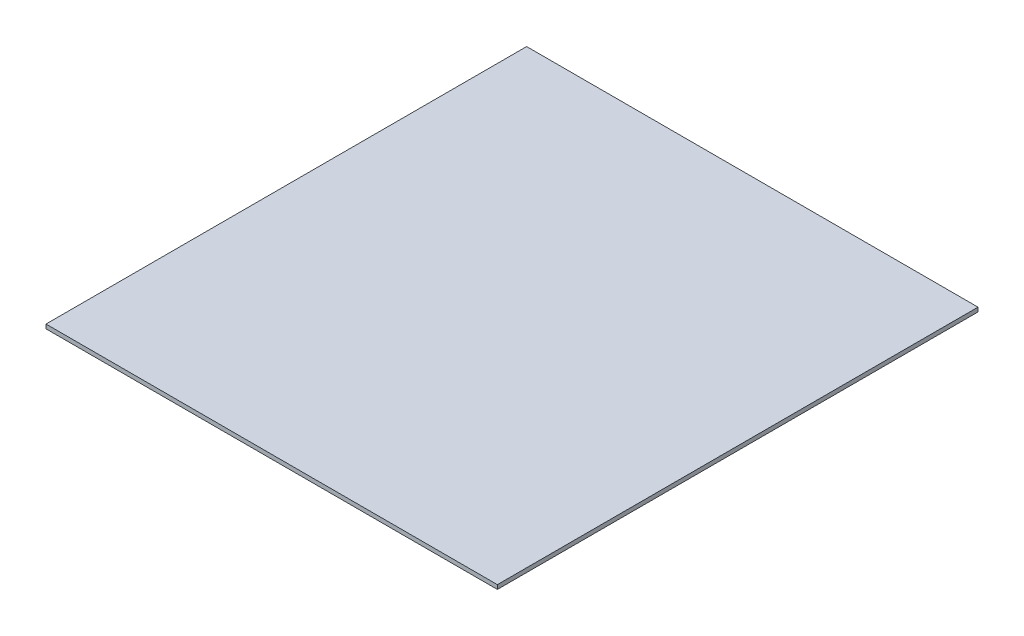
ISO-10303-21;
HEADER;
FILE_DESCRIPTION(('STEP AP214'),'2;1');
FILE_NAME('part.step','',(''),(''),'','','');
FILE_SCHEMA(('AUTOMOTIVE_DESIGN { 1 0 10303 214 1 1 1 1 }'));
ENDSEC;
DATA;
#1=APPLICATION_CONTEXT('core data for automotive mechanical design processes');
#2=APPLICATION_PROTOCOL_DEFINITION('international standard','automotive_design',2000,#1);
#3=PRODUCT_CONTEXT('',#1,'mechanical');
#4=PRODUCT('Part','Part','',(#3));
#5=PRODUCT_RELATED_PRODUCT_CATEGORY('part','',(#4));
#6=PRODUCT_DEFINITION_FORMATION('','',#4);
#7=PRODUCT_DEFINITION_CONTEXT('part definition',#1,'design');
#8=PRODUCT_DEFINITION('design','',#6,#7);
#9=PRODUCT_DEFINITION_SHAPE('','',#8);
#10=(LENGTH_UNIT() NAMED_UNIT(*) SI_UNIT(.MILLI.,.METRE.));
#11=(NAMED_UNIT(*) PLANE_ANGLE_UNIT() SI_UNIT($,.RADIAN.));
#12=(NAMED_UNIT(*) SI_UNIT($,.STERADIAN.) SOLID_ANGLE_UNIT());
#13=UNCERTAINTY_MEASURE_WITH_UNIT(LENGTH_MEASURE(1.E-05),#10,'distance_accuracy_value','');
#14=(GEOMETRIC_REPRESENTATION_CONTEXT(3) GLOBAL_UNCERTAINTY_ASSIGNED_CONTEXT((#13)) GLOBAL_UNIT_ASSIGNED_CONTEXT((#10,
#11,#12)) REPRESENTATION_CONTEXT('',''));
#15=CARTESIAN_POINT('',(0.,0.,0.));
#16=DIRECTION('',(0.,0.,1.));
#17=DIRECTION('',(1.,0.,0.));
#18=AXIS2_PLACEMENT_3D('',#15,#16,#17);
#19=CARTESIAN_POINT('',(0.,5.,0.));
#20=DIRECTION('',(-1.,0.,0.));
#21=DIRECTION('',(0.,0.,1.));
#22=AXIS2_PLACEMENT_3D('',#19,#20,#21);
#23=PLANE('',#22);
#24=DIRECTION('',(0.,0.,-1.));
#25=VECTOR('',#24,1.);
#26=CARTESIAN_POINT('',(0.,0.,0.));
#27=LINE('',#26,#25);
#28=CARTESIAN_POINT('',(0.,0.,575.));
#29=VERTEX_POINT('',#28);
#30=CARTESIAN_POINT('',(0.,0.,0.));
#31=VERTEX_POINT('',#30);
#32=EDGE_CURVE('E96',#29,#31,#27,.T.);
#33=ORIENTED_EDGE('',*,*,#32,.T.);
#34=DIRECTION('',(0.,-1.,0.));
#35=VECTOR('',#34,1.);
#36=CARTESIAN_POINT('',(0.,5.,0.));
#37=LINE('',#36,#35);
#38=CARTESIAN_POINT('',(0.,5.,0.));
#39=VERTEX_POINT('',#38);
#40=EDGE_CURVE('E11',#39,#31,#37,.T.);
#41=ORIENTED_EDGE('',*,*,#40,.F.);
#42=DIRECTION('',(0.,0.,-1.));
#43=VECTOR('',#42,1.);
#44=CARTESIAN_POINT('',(0.,5.,0.));
#45=LINE('',#44,#43);
#46=CARTESIAN_POINT('',(0.,5.,575.));
#47=VERTEX_POINT('',#46);
#48=EDGE_CURVE('E84',#47,#39,#45,.T.);
#49=ORIENTED_EDGE('',*,*,#48,.F.);
#50=DIRECTION('',(0.,-1.,0.));
#51=VECTOR('',#50,1.);
#52=CARTESIAN_POINT('',(0.,5.,575.));
#53=LINE('',#52,#51);
#54=EDGE_CURVE('E92',#47,#29,#53,.T.);
#55=ORIENTED_EDGE('',*,*,#54,.T.);
#56=EDGE_LOOP('',(#33,#41,#49,#55));
#57=FACE_BOUND('',#56,.T.);
#58=ADVANCED_FACE('F33',(#57),#23,.F.);
#59=CARTESIAN_POINT('',(0.,5.,0.));
#60=DIRECTION('',(0.,0.,1.));
#61=DIRECTION('',(1.,0.,0.));
#62=AXIS2_PLACEMENT_3D('',#59,#60,#61);
#63=PLANE('',#62);
#64=DIRECTION('',(-1.,0.,0.));
#65=VECTOR('',#64,1.);
#66=CARTESIAN_POINT('',(0.,0.,0.));
#67=LINE('',#66,#65);
#68=CARTESIAN_POINT('',(-540.,0.,0.));
#69=VERTEX_POINT('',#68);
#70=EDGE_CURVE('E88',#31,#69,#67,.T.);
#71=ORIENTED_EDGE('',*,*,#70,.T.);
#72=DIRECTION('',(0.,-1.,0.));
#73=VECTOR('',#72,1.);
#74=CARTESIAN_POINT('',(-540.,5.,0.));
#75=LINE('',#74,#73);
#76=CARTESIAN_POINT('',(-540.,5.,0.));
#77=VERTEX_POINT('',#76);
#78=EDGE_CURVE('E41',#77,#69,#75,.T.);
#79=ORIENTED_EDGE('',*,*,#78,.F.);
#80=DIRECTION('',(-1.,0.,0.));
#81=VECTOR('',#80,1.);
#82=CARTESIAN_POINT('',(0.,5.,0.));
#83=LINE('',#82,#81);
#84=EDGE_CURVE('E79',#39,#77,#83,.T.);
#85=ORIENTED_EDGE('',*,*,#84,.F.);
#86=ORIENTED_EDGE('',*,*,#40,.T.);
#87=EDGE_LOOP('',(#71,#79,#85,#86));
#88=FACE_BOUND('',#87,.T.);
#89=ADVANCED_FACE('F87',(#88),#63,.F.);
#90=CARTESIAN_POINT('',(-540.,5.,0.));
#91=DIRECTION('',(1.,0.,0.));
#92=DIRECTION('',(0.,0.,-1.));
#93=AXIS2_PLACEMENT_3D('',#90,#91,#92);
#94=PLANE('',#93);
#95=DIRECTION('',(0.,0.,1.));
#96=VECTOR('',#95,1.);
#97=CARTESIAN_POINT('',(-540.,0.,0.));
#98=LINE('',#97,#96);
#99=CARTESIAN_POINT('',(-540.,0.,575.));
#100=VERTEX_POINT('',#99);
#101=EDGE_CURVE('E66',#69,#100,#98,.T.);
#102=ORIENTED_EDGE('',*,*,#101,.T.);
#103=DIRECTION('',(0.,-1.,0.));
#104=VECTOR('',#103,1.);
#105=CARTESIAN_POINT('',(-540.,5.,575.));
#106=LINE('',#105,#104);
#107=CARTESIAN_POINT('',(-540.,5.,575.));
#108=VERTEX_POINT('',#107);
#109=EDGE_CURVE('E89',#108,#100,#106,.T.);
#110=ORIENTED_EDGE('',*,*,#109,.F.);
#111=DIRECTION('',(0.,0.,1.));
#112=VECTOR('',#111,1.);
#113=CARTESIAN_POINT('',(-540.,5.,0.));
#114=LINE('',#113,#112);
#115=EDGE_CURVE('E82',#77,#108,#114,.T.);
#116=ORIENTED_EDGE('',*,*,#115,.F.);
#117=ORIENTED_EDGE('',*,*,#78,.T.);
#118=EDGE_LOOP('',(#102,#110,#116,#117));
#119=FACE_BOUND('',#118,.T.);
#120=ADVANCED_FACE('F90',(#119),#94,.F.);
#121=CARTESIAN_POINT('',(0.,5.,575.));
#122=DIRECTION('',(0.,0.,-1.));
#123=DIRECTION('',(-1.,0.,0.));
#124=AXIS2_PLACEMENT_3D('',#121,#122,#123);
#125=PLANE('',#124);
#126=DIRECTION('',(1.,0.,0.));
#127=VECTOR('',#126,1.);
#128=CARTESIAN_POINT('',(0.,0.,575.));
#129=LINE('',#128,#127);
#130=EDGE_CURVE('E72',#100,#29,#129,.T.);
#131=ORIENTED_EDGE('',*,*,#130,.T.);
#132=ORIENTED_EDGE('',*,*,#54,.F.);
#133=DIRECTION('',(1.,0.,0.));
#134=VECTOR('',#133,1.);
#135=CARTESIAN_POINT('',(0.,5.,575.));
#136=LINE('',#135,#134);
#137=EDGE_CURVE('E49',#108,#47,#136,.T.);
#138=ORIENTED_EDGE('',*,*,#137,.F.);
#139=ORIENTED_EDGE('',*,*,#109,.T.);
#140=EDGE_LOOP('',(#131,#132,#138,#139));
#141=FACE_BOUND('',#140,.T.);
#142=ADVANCED_FACE('F103',(#141),#125,.F.);
#143=CARTESIAN_POINT('',(0.,5.,0.));
#144=DIRECTION('',(0.,-1.,0.));
#145=DIRECTION('',(0.,0.,-1.));
#146=AXIS2_PLACEMENT_3D('',#143,#144,#145);
#147=PLANE('',#146);
#148=ORIENTED_EDGE('',*,*,#48,.T.);
#149=ORIENTED_EDGE('',*,*,#84,.T.);
#150=ORIENTED_EDGE('',*,*,#115,.T.);
#151=ORIENTED_EDGE('',*,*,#137,.T.);
#152=EDGE_LOOP('',(#148,#149,#150,#151));
#153=FACE_BOUND('',#152,.T.);
#154=ADVANCED_FACE('F80',(#153),#147,.F.);
#155=CARTESIAN_POINT('',(0.,0.,0.));
#156=DIRECTION('',(0.,-1.,0.));
#157=DIRECTION('',(0.,0.,-1.));
#158=AXIS2_PLACEMENT_3D('',#155,#156,#157);
#159=PLANE('',#158);
#160=ORIENTED_EDGE('',*,*,#32,.F.);
#161=ORIENTED_EDGE('',*,*,#130,.F.);
#162=ORIENTED_EDGE('',*,*,#101,.F.);
#163=ORIENTED_EDGE('',*,*,#70,.F.);
#164=EDGE_LOOP('',(#160,#161,#162,#163));
#165=FACE_BOUND('',#164,.T.);
#166=ADVANCED_FACE('F106',(#165),#159,.T.);
#167=CLOSED_SHELL('',(#58,#89,#120,#142,#154,#166));
#168=MANIFOLD_SOLID_BREP('B2',#167);
#169=ADVANCED_BREP_SHAPE_REPRESENTATION('',(#18,#168),#14);
#170=SHAPE_DEFINITION_REPRESENTATION(#9,#169);
ENDSEC;
END-ISO-10303-21;
